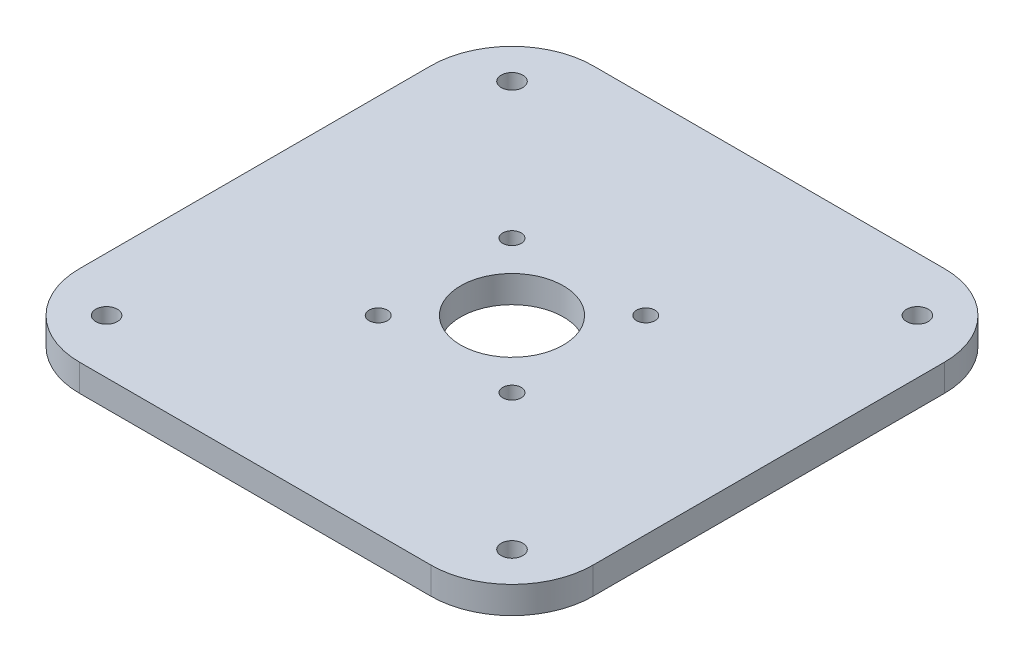
ISO-10303-21;
HEADER;
FILE_DESCRIPTION(('STEP AP214'),'2;1');
FILE_NAME('part.step','',(''),(''),'','','');
FILE_SCHEMA(('AUTOMOTIVE_DESIGN { 1 0 10303 214 1 1 1 1 }'));
ENDSEC;
DATA;
#1=APPLICATION_CONTEXT('core data for automotive mechanical design processes');
#2=APPLICATION_PROTOCOL_DEFINITION('international standard','automotive_design',2000,#1);
#3=PRODUCT_CONTEXT('',#1,'mechanical');
#4=PRODUCT('Part','Part','',(#3));
#5=PRODUCT_RELATED_PRODUCT_CATEGORY('part','',(#4));
#6=PRODUCT_DEFINITION_FORMATION('','',#4);
#7=PRODUCT_DEFINITION_CONTEXT('part definition',#1,'design');
#8=PRODUCT_DEFINITION('design','',#6,#7);
#9=PRODUCT_DEFINITION_SHAPE('','',#8);
#10=(LENGTH_UNIT() NAMED_UNIT(*) SI_UNIT(.MILLI.,.METRE.));
#11=(NAMED_UNIT(*) PLANE_ANGLE_UNIT() SI_UNIT($,.RADIAN.));
#12=(NAMED_UNIT(*) SI_UNIT($,.STERADIAN.) SOLID_ANGLE_UNIT());
#13=UNCERTAINTY_MEASURE_WITH_UNIT(LENGTH_MEASURE(1.E-05),#10,'distance_accuracy_value','');
#14=(GEOMETRIC_REPRESENTATION_CONTEXT(3) GLOBAL_UNCERTAINTY_ASSIGNED_CONTEXT((#13)) GLOBAL_UNIT_ASSIGNED_CONTEXT((#10,
#11,#12)) REPRESENTATION_CONTEXT('',''));
#15=CARTESIAN_POINT('',(0.,0.,0.));
#16=DIRECTION('',(0.,0.,1.));
#17=DIRECTION('',(1.,0.,0.));
#18=AXIS2_PLACEMENT_3D('',#15,#16,#17);
#19=CARTESIAN_POINT('',(-95.,10.,95.));
#20=DIRECTION('',(1.,0.,0.));
#21=DIRECTION('',(0.,0.,-1.));
#22=AXIS2_PLACEMENT_3D('',#19,#20,#21);
#23=PLANE('',#22);
#24=DIRECTION('',(0.,0.,1.));
#25=VECTOR('',#24,1.);
#26=CARTESIAN_POINT('',(-95.,0.,95.));
#27=LINE('',#26,#25);
#28=CARTESIAN_POINT('',(-95.,0.,-65.));
#29=VERTEX_POINT('',#28);
#30=CARTESIAN_POINT('',(-95.,0.,65.));
#31=VERTEX_POINT('',#30);
#32=EDGE_CURVE('E134',#29,#31,#27,.T.);
#33=ORIENTED_EDGE('',*,*,#32,.T.);
#34=DIRECTION('',(0.,-1.,0.));
#35=VECTOR('',#34,1.);
#36=CARTESIAN_POINT('',(-95.,10.,65.));
#37=LINE('',#36,#35);
#38=CARTESIAN_POINT('',(-95.,10.,65.));
#39=VERTEX_POINT('',#38);
#40=EDGE_CURVE('E112',#31,#39,#37,.F.);
#41=ORIENTED_EDGE('',*,*,#40,.T.);
#42=DIRECTION('',(0.,0.,1.));
#43=VECTOR('',#42,1.);
#44=CARTESIAN_POINT('',(-95.,10.,95.));
#45=LINE('',#44,#43);
#46=CARTESIAN_POINT('',(-95.,10.,-65.));
#47=VERTEX_POINT('',#46);
#48=EDGE_CURVE('E144',#47,#39,#45,.T.);
#49=ORIENTED_EDGE('',*,*,#48,.F.);
#50=DIRECTION('',(0.,-1.,0.));
#51=VECTOR('',#50,1.);
#52=CARTESIAN_POINT('',(-95.,10.,-65.));
#53=LINE('',#52,#51);
#54=EDGE_CURVE('E117',#47,#29,#53,.T.);
#55=ORIENTED_EDGE('',*,*,#54,.T.);
#56=EDGE_LOOP('',(#33,#41,#49,#55));
#57=FACE_BOUND('',#56,.T.);
#58=ADVANCED_FACE('F39',(#57),#23,.F.);
#59=CARTESIAN_POINT('',(95.,10.,94.9999999999999));
#60=DIRECTION('',(0.,0.,-1.));
#61=DIRECTION('',(-1.,0.,0.));
#62=AXIS2_PLACEMENT_3D('',#59,#60,#61);
#63=PLANE('',#62);
#64=DIRECTION('',(1.,0.,0.));
#65=VECTOR('',#64,1.);
#66=CARTESIAN_POINT('',(95.,10.,94.9999999999999));
#67=LINE('',#66,#65);
#68=CARTESIAN_POINT('',(-65.,10.,95.));
#69=VERTEX_POINT('',#68);
#70=CARTESIAN_POINT('',(65.,10.,94.9999999999999));
#71=VERTEX_POINT('',#70);
#72=EDGE_CURVE('E127',#69,#71,#67,.T.);
#73=ORIENTED_EDGE('',*,*,#72,.F.);
#74=DIRECTION('',(0.,-1.,0.));
#75=VECTOR('',#74,1.);
#76=CARTESIAN_POINT('',(-65.,10.,95.));
#77=LINE('',#76,#75);
#78=CARTESIAN_POINT('',(-65.,0.,95.));
#79=VERTEX_POINT('',#78);
#80=EDGE_CURVE('E111',#69,#79,#77,.T.);
#81=ORIENTED_EDGE('',*,*,#80,.T.);
#82=DIRECTION('',(1.,0.,0.));
#83=VECTOR('',#82,1.);
#84=CARTESIAN_POINT('',(95.,0.,94.9999999999999));
#85=LINE('',#84,#83);
#86=CARTESIAN_POINT('',(65.,0.,94.9999999999999));
#87=VERTEX_POINT('',#86);
#88=EDGE_CURVE('E124',#79,#87,#85,.T.);
#89=ORIENTED_EDGE('',*,*,#88,.T.);
#90=DIRECTION('',(0.,-1.,0.));
#91=VECTOR('',#90,1.);
#92=CARTESIAN_POINT('',(65.,10.,94.9999999999999));
#93=LINE('',#92,#91);
#94=EDGE_CURVE('E129',#87,#71,#93,.F.);
#95=ORIENTED_EDGE('',*,*,#94,.T.);
#96=EDGE_LOOP('',(#73,#81,#89,#95));
#97=FACE_BOUND('',#96,.T.);
#98=ADVANCED_FACE('F123',(#97),#63,.F.);
#99=CARTESIAN_POINT('',(95.,10.,94.9999999999999));
#100=DIRECTION('',(-1.,0.,0.));
#101=DIRECTION('',(0.,0.,1.));
#102=AXIS2_PLACEMENT_3D('',#99,#100,#101);
#103=PLANE('',#102);
#104=DIRECTION('',(0.,0.,-1.));
#105=VECTOR('',#104,1.);
#106=CARTESIAN_POINT('',(95.,10.,94.9999999999999));
#107=LINE('',#106,#105);
#108=CARTESIAN_POINT('',(95.,10.,64.9999999999999));
#109=VERTEX_POINT('',#108);
#110=CARTESIAN_POINT('',(95.,10.,-65.0000000000001));
#111=VERTEX_POINT('',#110);
#112=EDGE_CURVE('E223',#109,#111,#107,.T.);
#113=ORIENTED_EDGE('',*,*,#112,.F.);
#114=DIRECTION('',(0.,-1.,0.));
#115=VECTOR('',#114,1.);
#116=CARTESIAN_POINT('',(95.,10.,64.9999999999999));
#117=LINE('',#116,#115);
#118=CARTESIAN_POINT('',(95.,0.,64.9999999999999));
#119=VERTEX_POINT('',#118);
#120=EDGE_CURVE('E163',#109,#119,#117,.T.);
#121=ORIENTED_EDGE('',*,*,#120,.T.);
#122=DIRECTION('',(0.,0.,-1.));
#123=VECTOR('',#122,1.);
#124=CARTESIAN_POINT('',(95.,0.,94.9999999999999));
#125=LINE('',#124,#123);
#126=CARTESIAN_POINT('',(95.,0.,-65.0000000000001));
#127=VERTEX_POINT('',#126);
#128=EDGE_CURVE('E133',#119,#127,#125,.T.);
#129=ORIENTED_EDGE('',*,*,#128,.T.);
#130=DIRECTION('',(0.,-1.,0.));
#131=VECTOR('',#130,1.);
#132=CARTESIAN_POINT('',(95.,10.,-65.0000000000001));
#133=LINE('',#132,#131);
#134=EDGE_CURVE('E161',#127,#111,#133,.F.);
#135=ORIENTED_EDGE('',*,*,#134,.T.);
#136=EDGE_LOOP('',(#113,#121,#129,#135));
#137=FACE_BOUND('',#136,.T.);
#138=ADVANCED_FACE('F238',(#137),#103,.F.);
#139=CARTESIAN_POINT('',(95.,10.,-95.0000000000001));
#140=DIRECTION('',(0.,0.,1.));
#141=DIRECTION('',(1.,0.,0.));
#142=AXIS2_PLACEMENT_3D('',#139,#140,#141);
#143=PLANE('',#142);
#144=DIRECTION('',(-1.,0.,0.));
#145=VECTOR('',#144,1.);
#146=CARTESIAN_POINT('',(95.,10.,-95.0000000000001));
#147=LINE('',#146,#145);
#148=CARTESIAN_POINT('',(65.,10.,-95.0000000000001));
#149=VERTEX_POINT('',#148);
#150=CARTESIAN_POINT('',(-65.,10.,-95.));
#151=VERTEX_POINT('',#150);
#152=EDGE_CURVE('E145',#149,#151,#147,.T.);
#153=ORIENTED_EDGE('',*,*,#152,.F.);
#154=DIRECTION('',(0.,-1.,0.));
#155=VECTOR('',#154,1.);
#156=CARTESIAN_POINT('',(65.,10.,-95.0000000000001));
#157=LINE('',#156,#155);
#158=CARTESIAN_POINT('',(65.,0.,-95.0000000000001));
#159=VERTEX_POINT('',#158);
#160=EDGE_CURVE('E11',#149,#159,#157,.T.);
#161=ORIENTED_EDGE('',*,*,#160,.T.);
#162=DIRECTION('',(-1.,0.,0.));
#163=VECTOR('',#162,1.);
#164=CARTESIAN_POINT('',(95.,0.,-95.0000000000001));
#165=LINE('',#164,#163);
#166=CARTESIAN_POINT('',(-65.,0.,-95.));
#167=VERTEX_POINT('',#166);
#168=EDGE_CURVE('E137',#159,#167,#165,.T.);
#169=ORIENTED_EDGE('',*,*,#168,.T.);
#170=DIRECTION('',(0.,-1.,0.));
#171=VECTOR('',#170,1.);
#172=CARTESIAN_POINT('',(-65.,10.,-95.));
#173=LINE('',#172,#171);
#174=EDGE_CURVE('E48',#167,#151,#173,.F.);
#175=ORIENTED_EDGE('',*,*,#174,.T.);
#176=EDGE_LOOP('',(#153,#161,#169,#175));
#177=FACE_BOUND('',#176,.T.);
#178=ADVANCED_FACE('F232',(#177),#143,.F.);
#179=CARTESIAN_POINT('',(0.,10.,0.));
#180=DIRECTION('',(0.,1.,0.));
#181=DIRECTION('',(0.,0.,1.));
#182=AXIS2_PLACEMENT_3D('',#179,#180,#181);
#183=PLANE('',#182);
#184=CARTESIAN_POINT('',(-24.7487373415292,10.,-24.7487373415292));
#185=DIRECTION('',(0.,1.,0.));
#186=DIRECTION('',(0.,0.,1.));
#187=AXIS2_PLACEMENT_3D('',#184,#185,#186);
#188=CIRCLE('',#187,3.39999999999999);
#189=CARTESIAN_POINT('',(-24.7487373415292,10.,-21.3487373415292));
#190=VERTEX_POINT('',#189);
#191=EDGE_CURVE('E183',#190,#190,#188,.T.);
#192=ORIENTED_EDGE('',*,*,#191,.F.);
#193=EDGE_LOOP('',(#192));
#194=FACE_BOUND('',#193,.T.);
#195=CARTESIAN_POINT('',(24.7487373415292,10.,-24.7487373415292));
#196=DIRECTION('',(0.,1.,0.));
#197=DIRECTION('',(0.,0.,1.));
#198=AXIS2_PLACEMENT_3D('',#195,#196,#197);
#199=CIRCLE('',#198,3.39999999999999);
#200=CARTESIAN_POINT('',(24.7487373415292,10.,-21.3487373415292));
#201=VERTEX_POINT('',#200);
#202=EDGE_CURVE('E173',#201,#201,#199,.T.);
#203=ORIENTED_EDGE('',*,*,#202,.F.);
#204=EDGE_LOOP('',(#203));
#205=FACE_BOUND('',#204,.T.);
#206=CARTESIAN_POINT('',(-24.7487373415292,10.,24.7487373415292));
#207=DIRECTION('',(0.,1.,0.));
#208=DIRECTION('',(0.,0.,1.));
#209=AXIS2_PLACEMENT_3D('',#206,#207,#208);
#210=CIRCLE('',#209,3.39999999999999);
#211=CARTESIAN_POINT('',(-24.7487373415292,10.,28.1487373415291));
#212=VERTEX_POINT('',#211);
#213=EDGE_CURVE('E170',#212,#212,#210,.T.);
#214=ORIENTED_EDGE('',*,*,#213,.F.);
#215=EDGE_LOOP('',(#214));
#216=FACE_BOUND('',#215,.T.);
#217=CARTESIAN_POINT('',(24.7487373415292,10.,24.7487373415292));
#218=DIRECTION('',(0.,1.,0.));
#219=DIRECTION('',(0.,0.,1.));
#220=AXIS2_PLACEMENT_3D('',#217,#218,#219);
#221=CIRCLE('',#220,3.39999999999999);
#222=CARTESIAN_POINT('',(24.7487373415292,10.,28.1487373415291));
#223=VERTEX_POINT('',#222);
#224=EDGE_CURVE('E169',#223,#223,#221,.T.);
#225=ORIENTED_EDGE('',*,*,#224,.F.);
#226=EDGE_LOOP('',(#225));
#227=FACE_BOUND('',#226,.T.);
#228=CARTESIAN_POINT('',(-75.,10.,75.));
#229=DIRECTION('',(0.,1.,0.));
#230=DIRECTION('',(0.,0.,-1.));
#231=AXIS2_PLACEMENT_3D('',#228,#229,#230);
#232=CIRCLE('',#231,4.00000000000001);
#233=CARTESIAN_POINT('',(-75.,10.,71.));
#234=VERTEX_POINT('',#233);
#235=EDGE_CURVE('E191',#234,#234,#232,.T.);
#236=ORIENTED_EDGE('',*,*,#235,.F.);
#237=EDGE_LOOP('',(#236));
#238=FACE_BOUND('',#237,.T.);
#239=CARTESIAN_POINT('',(75.,10.,75.));
#240=DIRECTION('',(0.,1.,0.));
#241=DIRECTION('',(0.,0.,1.));
#242=AXIS2_PLACEMENT_3D('',#239,#240,#241);
#243=CIRCLE('',#242,4.00000000000001);
#244=CARTESIAN_POINT('',(75.,10.,79.));
#245=VERTEX_POINT('',#244);
#246=EDGE_CURVE('E208',#245,#245,#243,.T.);
#247=ORIENTED_EDGE('',*,*,#246,.F.);
#248=EDGE_LOOP('',(#247));
#249=FACE_BOUND('',#248,.T.);
#250=CARTESIAN_POINT('',(75.,10.,-75.));
#251=DIRECTION('',(0.,1.,0.));
#252=DIRECTION('',(0.,0.,-1.));
#253=AXIS2_PLACEMENT_3D('',#250,#251,#252);
#254=CIRCLE('',#253,4.00000000000001);
#255=CARTESIAN_POINT('',(75.,10.,-79.));
#256=VERTEX_POINT('',#255);
#257=EDGE_CURVE('E202',#256,#256,#254,.T.);
#258=ORIENTED_EDGE('',*,*,#257,.F.);
#259=EDGE_LOOP('',(#258));
#260=FACE_BOUND('',#259,.T.);
#261=CARTESIAN_POINT('',(-75.,10.,-75.));
#262=DIRECTION('',(0.,1.,0.));
#263=DIRECTION('',(0.,0.,1.));
#264=AXIS2_PLACEMENT_3D('',#261,#262,#263);
#265=CIRCLE('',#264,4.00000000000001);
#266=CARTESIAN_POINT('',(-75.,10.,-71.));
#267=VERTEX_POINT('',#266);
#268=EDGE_CURVE('E196',#267,#267,#265,.T.);
#269=ORIENTED_EDGE('',*,*,#268,.F.);
#270=EDGE_LOOP('',(#269));
#271=FACE_BOUND('',#270,.T.);
#272=CARTESIAN_POINT('',(0.,10.,0.));
#273=DIRECTION('',(0.,1.,0.));
#274=DIRECTION('',(0.,0.,1.));
#275=AXIS2_PLACEMENT_3D('',#272,#273,#274);
#276=CIRCLE('',#275,19.);
#277=CARTESIAN_POINT('',(0.,10.,19.));
#278=VERTEX_POINT('',#277);
#279=EDGE_CURVE('E195',#278,#278,#276,.T.);
#280=ORIENTED_EDGE('',*,*,#279,.F.);
#281=EDGE_LOOP('',(#280));
#282=FACE_BOUND('',#281,.T.);
#283=ORIENTED_EDGE('',*,*,#48,.T.);
#284=CARTESIAN_POINT('',(-65.,10.,65.));
#285=DIRECTION('',(0.,1.,0.));
#286=DIRECTION('',(0.,0.,1.));
#287=AXIS2_PLACEMENT_3D('',#284,#285,#286);
#288=CIRCLE('',#287,30.);
#289=EDGE_CURVE('E159',#39,#69,#288,.T.);
#290=ORIENTED_EDGE('',*,*,#289,.T.);
#291=ORIENTED_EDGE('',*,*,#72,.T.);
#292=CARTESIAN_POINT('',(65.,10.,64.9999999999999));
#293=DIRECTION('',(0.,1.,0.));
#294=DIRECTION('',(0.,0.,1.));
#295=AXIS2_PLACEMENT_3D('',#292,#293,#294);
#296=CIRCLE('',#295,30.);
#297=EDGE_CURVE('E157',#71,#109,#296,.T.);
#298=ORIENTED_EDGE('',*,*,#297,.T.);
#299=ORIENTED_EDGE('',*,*,#112,.T.);
#300=CARTESIAN_POINT('',(65.,10.,-65.0000000000001));
#301=DIRECTION('',(0.,1.,0.));
#302=DIRECTION('',(0.,0.,1.));
#303=AXIS2_PLACEMENT_3D('',#300,#301,#302);
#304=CIRCLE('',#303,30.);
#305=EDGE_CURVE('E62',#111,#149,#304,.T.);
#306=ORIENTED_EDGE('',*,*,#305,.T.);
#307=ORIENTED_EDGE('',*,*,#152,.T.);
#308=CARTESIAN_POINT('',(-65.,10.,-65.));
#309=DIRECTION('',(0.,1.,0.));
#310=DIRECTION('',(0.,0.,1.));
#311=AXIS2_PLACEMENT_3D('',#308,#309,#310);
#312=CIRCLE('',#311,30.);
#313=EDGE_CURVE('E154',#151,#47,#312,.T.);
#314=ORIENTED_EDGE('',*,*,#313,.T.);
#315=EDGE_LOOP('',(#283,#290,#291,#298,#299,#306,#307,#314));
#316=FACE_BOUND('',#315,.T.);
#317=ADVANCED_FACE('F225',(#194,#205,#216,#227,#238,#249,#260,#271,#282,#316),#183,.T.);
#318=CARTESIAN_POINT('',(0.,0.,0.));
#319=DIRECTION('',(0.,1.,0.));
#320=DIRECTION('',(0.,0.,1.));
#321=AXIS2_PLACEMENT_3D('',#318,#319,#320);
#322=PLANE('',#321);
#323=CARTESIAN_POINT('',(-24.7487373415292,0.,-24.7487373415292));
#324=DIRECTION('',(0.,1.,0.));
#325=DIRECTION('',(0.,0.,1.));
#326=AXIS2_PLACEMENT_3D('',#323,#324,#325);
#327=CIRCLE('',#326,3.39999999999999);
#328=CARTESIAN_POINT('',(-24.7487373415292,0.,-21.3487373415292));
#329=VERTEX_POINT('',#328);
#330=EDGE_CURVE('E43',#329,#329,#327,.T.);
#331=ORIENTED_EDGE('',*,*,#330,.T.);
#332=EDGE_LOOP('',(#331));
#333=FACE_BOUND('',#332,.T.);
#334=CARTESIAN_POINT('',(24.7487373415292,0.,-24.7487373415292));
#335=DIRECTION('',(0.,1.,0.));
#336=DIRECTION('',(0.,0.,1.));
#337=AXIS2_PLACEMENT_3D('',#334,#335,#336);
#338=CIRCLE('',#337,3.39999999999999);
#339=CARTESIAN_POINT('',(24.7487373415292,0.,-21.3487373415292));
#340=VERTEX_POINT('',#339);
#341=EDGE_CURVE('E171',#340,#340,#338,.T.);
#342=ORIENTED_EDGE('',*,*,#341,.T.);
#343=EDGE_LOOP('',(#342));
#344=FACE_BOUND('',#343,.T.);
#345=CARTESIAN_POINT('',(-24.7487373415292,0.,24.7487373415292));
#346=DIRECTION('',(0.,1.,0.));
#347=DIRECTION('',(0.,0.,1.));
#348=AXIS2_PLACEMENT_3D('',#345,#346,#347);
#349=CIRCLE('',#348,3.39999999999999);
#350=CARTESIAN_POINT('',(-24.7487373415292,0.,28.1487373415291));
#351=VERTEX_POINT('',#350);
#352=EDGE_CURVE('E167',#351,#351,#349,.T.);
#353=ORIENTED_EDGE('',*,*,#352,.T.);
#354=EDGE_LOOP('',(#353));
#355=FACE_BOUND('',#354,.T.);
#356=CARTESIAN_POINT('',(24.7487373415292,0.,24.7487373415292));
#357=DIRECTION('',(0.,1.,0.));
#358=DIRECTION('',(0.,0.,1.));
#359=AXIS2_PLACEMENT_3D('',#356,#357,#358);
#360=CIRCLE('',#359,3.39999999999999);
#361=CARTESIAN_POINT('',(24.7487373415292,0.,28.1487373415291));
#362=VERTEX_POINT('',#361);
#363=EDGE_CURVE('E188',#362,#362,#360,.T.);
#364=ORIENTED_EDGE('',*,*,#363,.T.);
#365=EDGE_LOOP('',(#364));
#366=FACE_BOUND('',#365,.T.);
#367=CARTESIAN_POINT('',(-75.,0.,75.));
#368=DIRECTION('',(0.,1.,0.));
#369=DIRECTION('',(0.,0.,-1.));
#370=AXIS2_PLACEMENT_3D('',#367,#368,#369);
#371=CIRCLE('',#370,4.00000000000001);
#372=CARTESIAN_POINT('',(-75.,0.,71.));
#373=VERTEX_POINT('',#372);
#374=EDGE_CURVE('E211',#373,#373,#371,.T.);
#375=ORIENTED_EDGE('',*,*,#374,.T.);
#376=EDGE_LOOP('',(#375));
#377=FACE_BOUND('',#376,.T.);
#378=CARTESIAN_POINT('',(75.,0.,75.));
#379=DIRECTION('',(0.,1.,0.));
#380=DIRECTION('',(0.,0.,1.));
#381=AXIS2_PLACEMENT_3D('',#378,#379,#380);
#382=CIRCLE('',#381,4.00000000000001);
#383=CARTESIAN_POINT('',(75.,0.,79.));
#384=VERTEX_POINT('',#383);
#385=EDGE_CURVE('E205',#384,#384,#382,.T.);
#386=ORIENTED_EDGE('',*,*,#385,.T.);
#387=EDGE_LOOP('',(#386));
#388=FACE_BOUND('',#387,.T.);
#389=CARTESIAN_POINT('',(75.,0.,-75.));
#390=DIRECTION('',(0.,1.,0.));
#391=DIRECTION('',(0.,0.,-1.));
#392=AXIS2_PLACEMENT_3D('',#389,#390,#391);
#393=CIRCLE('',#392,4.00000000000001);
#394=CARTESIAN_POINT('',(75.,0.,-79.));
#395=VERTEX_POINT('',#394);
#396=EDGE_CURVE('E199',#395,#395,#393,.T.);
#397=ORIENTED_EDGE('',*,*,#396,.T.);
#398=EDGE_LOOP('',(#397));
#399=FACE_BOUND('',#398,.T.);
#400=CARTESIAN_POINT('',(-75.,0.,-75.));
#401=DIRECTION('',(0.,1.,0.));
#402=DIRECTION('',(0.,0.,1.));
#403=AXIS2_PLACEMENT_3D('',#400,#401,#402);
#404=CIRCLE('',#403,4.00000000000001);
#405=CARTESIAN_POINT('',(-75.,0.,-71.));
#406=VERTEX_POINT('',#405);
#407=EDGE_CURVE('E192',#406,#406,#404,.T.);
#408=ORIENTED_EDGE('',*,*,#407,.T.);
#409=EDGE_LOOP('',(#408));
#410=FACE_BOUND('',#409,.T.);
#411=CARTESIAN_POINT('',(0.,0.,0.));
#412=DIRECTION('',(0.,1.,0.));
#413=DIRECTION('',(0.,0.,1.));
#414=AXIS2_PLACEMENT_3D('',#411,#412,#413);
#415=CIRCLE('',#414,19.);
#416=CARTESIAN_POINT('',(0.,0.,19.));
#417=VERTEX_POINT('',#416);
#418=EDGE_CURVE('E139',#417,#417,#415,.T.);
#419=ORIENTED_EDGE('',*,*,#418,.T.);
#420=EDGE_LOOP('',(#419));
#421=FACE_BOUND('',#420,.T.);
#422=ORIENTED_EDGE('',*,*,#88,.F.);
#423=CARTESIAN_POINT('',(-65.,0.,65.));
#424=DIRECTION('',(0.,1.,0.));
#425=DIRECTION('',(0.,0.,1.));
#426=AXIS2_PLACEMENT_3D('',#423,#424,#425);
#427=CIRCLE('',#426,30.);
#428=EDGE_CURVE('E107',#79,#31,#427,.F.);
#429=ORIENTED_EDGE('',*,*,#428,.T.);
#430=ORIENTED_EDGE('',*,*,#32,.F.);
#431=CARTESIAN_POINT('',(-65.,0.,-65.));
#432=DIRECTION('',(0.,1.,0.));
#433=DIRECTION('',(0.,0.,1.));
#434=AXIS2_PLACEMENT_3D('',#431,#432,#433);
#435=CIRCLE('',#434,30.);
#436=EDGE_CURVE('E128',#29,#167,#435,.F.);
#437=ORIENTED_EDGE('',*,*,#436,.T.);
#438=ORIENTED_EDGE('',*,*,#168,.F.);
#439=CARTESIAN_POINT('',(65.,0.,-65.0000000000001));
#440=DIRECTION('',(0.,1.,0.));
#441=DIRECTION('',(0.,0.,1.));
#442=AXIS2_PLACEMENT_3D('',#439,#440,#441);
#443=CIRCLE('',#442,30.);
#444=EDGE_CURVE('E148',#159,#127,#443,.F.);
#445=ORIENTED_EDGE('',*,*,#444,.T.);
#446=ORIENTED_EDGE('',*,*,#128,.F.);
#447=CARTESIAN_POINT('',(65.,0.,64.9999999999999));
#448=DIRECTION('',(0.,1.,0.));
#449=DIRECTION('',(0.,0.,1.));
#450=AXIS2_PLACEMENT_3D('',#447,#448,#449);
#451=CIRCLE('',#450,30.);
#452=EDGE_CURVE('E118',#119,#87,#451,.F.);
#453=ORIENTED_EDGE('',*,*,#452,.T.);
#454=EDGE_LOOP('',(#422,#429,#430,#437,#438,#445,#446,#453));
#455=FACE_BOUND('',#454,.T.);
#456=ADVANCED_FACE('F131',(#333,#344,#355,#366,#377,#388,#399,#410,#421,#455),#322,.F.);
#457=CARTESIAN_POINT('',(0.,0.,0.));
#458=DIRECTION('',(0.,1.,0.));
#459=DIRECTION('',(0.,0.,1.));
#460=AXIS2_PLACEMENT_3D('',#457,#458,#459);
#461=CYLINDRICAL_SURFACE('',#460,19.);
#462=ORIENTED_EDGE('',*,*,#418,.F.);
#463=EDGE_LOOP('',(#462));
#464=FACE_BOUND('',#463,.T.);
#465=ORIENTED_EDGE('',*,*,#279,.T.);
#466=EDGE_LOOP('',(#465));
#467=FACE_BOUND('',#466,.T.);
#468=ADVANCED_FACE('F264',(#464,#467),#461,.F.);
#469=CARTESIAN_POINT('',(-75.,0.,-75.));
#470=DIRECTION('',(0.,1.,0.));
#471=DIRECTION('',(0.,0.,1.));
#472=AXIS2_PLACEMENT_3D('',#469,#470,#471);
#473=CYLINDRICAL_SURFACE('',#472,4.00000000000001);
#474=ORIENTED_EDGE('',*,*,#407,.F.);
#475=EDGE_LOOP('',(#474));
#476=FACE_BOUND('',#475,.T.);
#477=ORIENTED_EDGE('',*,*,#268,.T.);
#478=EDGE_LOOP('',(#477));
#479=FACE_BOUND('',#478,.T.);
#480=ADVANCED_FACE('F271',(#476,#479),#473,.F.);
#481=CARTESIAN_POINT('',(75.,0.,-75.));
#482=DIRECTION('',(0.,1.,0.));
#483=DIRECTION('',(0.,0.,1.));
#484=AXIS2_PLACEMENT_3D('',#481,#482,#483);
#485=CYLINDRICAL_SURFACE('',#484,4.00000000000001);
#486=ORIENTED_EDGE('',*,*,#396,.F.);
#487=EDGE_LOOP('',(#486));
#488=FACE_BOUND('',#487,.T.);
#489=ORIENTED_EDGE('',*,*,#257,.T.);
#490=EDGE_LOOP('',(#489));
#491=FACE_BOUND('',#490,.T.);
#492=ADVANCED_FACE('F279',(#488,#491),#485,.F.);
#493=CARTESIAN_POINT('',(75.,0.,75.));
#494=DIRECTION('',(0.,1.,0.));
#495=DIRECTION('',(0.,0.,1.));
#496=AXIS2_PLACEMENT_3D('',#493,#494,#495);
#497=CYLINDRICAL_SURFACE('',#496,4.00000000000001);
#498=ORIENTED_EDGE('',*,*,#385,.F.);
#499=EDGE_LOOP('',(#498));
#500=FACE_BOUND('',#499,.T.);
#501=ORIENTED_EDGE('',*,*,#246,.T.);
#502=EDGE_LOOP('',(#501));
#503=FACE_BOUND('',#502,.T.);
#504=ADVANCED_FACE('F275',(#500,#503),#497,.F.);
#505=CARTESIAN_POINT('',(-75.,0.,75.));
#506=DIRECTION('',(0.,1.,0.));
#507=DIRECTION('',(0.,0.,1.));
#508=AXIS2_PLACEMENT_3D('',#505,#506,#507);
#509=CYLINDRICAL_SURFACE('',#508,4.00000000000001);
#510=ORIENTED_EDGE('',*,*,#374,.F.);
#511=EDGE_LOOP('',(#510));
#512=FACE_BOUND('',#511,.T.);
#513=ORIENTED_EDGE('',*,*,#235,.T.);
#514=EDGE_LOOP('',(#513));
#515=FACE_BOUND('',#514,.T.);
#516=ADVANCED_FACE('F249',(#512,#515),#509,.F.);
#517=CARTESIAN_POINT('',(-65.,10.,65.));
#518=DIRECTION('',(0.,-1.,0.));
#519=DIRECTION('',(0.,0.,-1.));
#520=AXIS2_PLACEMENT_3D('',#517,#518,#519);
#521=CYLINDRICAL_SURFACE('',#520,30.);
#522=ORIENTED_EDGE('',*,*,#289,.F.);
#523=ORIENTED_EDGE('',*,*,#40,.F.);
#524=ORIENTED_EDGE('',*,*,#428,.F.);
#525=ORIENTED_EDGE('',*,*,#80,.F.);
#526=EDGE_LOOP('',(#522,#523,#524,#525));
#527=FACE_BOUND('',#526,.T.);
#528=ADVANCED_FACE('F110',(#527),#521,.T.);
#529=CARTESIAN_POINT('',(65.,10.,64.9999999999999));
#530=DIRECTION('',(0.,-1.,0.));
#531=DIRECTION('',(0.,0.,-1.));
#532=AXIS2_PLACEMENT_3D('',#529,#530,#531);
#533=CYLINDRICAL_SURFACE('',#532,30.);
#534=ORIENTED_EDGE('',*,*,#297,.F.);
#535=ORIENTED_EDGE('',*,*,#94,.F.);
#536=ORIENTED_EDGE('',*,*,#452,.F.);
#537=ORIENTED_EDGE('',*,*,#120,.F.);
#538=EDGE_LOOP('',(#534,#535,#536,#537));
#539=FACE_BOUND('',#538,.T.);
#540=ADVANCED_FACE('F242',(#539),#533,.T.);
#541=CARTESIAN_POINT('',(65.,10.,-65.0000000000001));
#542=DIRECTION('',(0.,-1.,0.));
#543=DIRECTION('',(0.,0.,-1.));
#544=AXIS2_PLACEMENT_3D('',#541,#542,#543);
#545=CYLINDRICAL_SURFACE('',#544,30.);
#546=ORIENTED_EDGE('',*,*,#305,.F.);
#547=ORIENTED_EDGE('',*,*,#134,.F.);
#548=ORIENTED_EDGE('',*,*,#444,.F.);
#549=ORIENTED_EDGE('',*,*,#160,.F.);
#550=EDGE_LOOP('',(#546,#547,#548,#549));
#551=FACE_BOUND('',#550,.T.);
#552=ADVANCED_FACE('F234',(#551),#545,.T.);
#553=CARTESIAN_POINT('',(-65.,10.,-65.));
#554=DIRECTION('',(0.,-1.,0.));
#555=DIRECTION('',(0.,0.,-1.));
#556=AXIS2_PLACEMENT_3D('',#553,#554,#555);
#557=CYLINDRICAL_SURFACE('',#556,30.);
#558=ORIENTED_EDGE('',*,*,#313,.F.);
#559=ORIENTED_EDGE('',*,*,#174,.F.);
#560=ORIENTED_EDGE('',*,*,#436,.F.);
#561=ORIENTED_EDGE('',*,*,#54,.F.);
#562=EDGE_LOOP('',(#558,#559,#560,#561));
#563=FACE_BOUND('',#562,.T.);
#564=ADVANCED_FACE('F41',(#563),#557,.T.);
#565=CARTESIAN_POINT('',(24.7487373415292,10.,24.7487373415292));
#566=DIRECTION('',(0.,1.,0.));
#567=DIRECTION('',(0.,0.,1.));
#568=AXIS2_PLACEMENT_3D('',#565,#566,#567);
#569=CYLINDRICAL_SURFACE('',#568,3.39999999999999);
#570=ORIENTED_EDGE('',*,*,#224,.T.);
#571=EDGE_LOOP('',(#570));
#572=FACE_BOUND('',#571,.T.);
#573=ORIENTED_EDGE('',*,*,#363,.F.);
#574=EDGE_LOOP('',(#573));
#575=FACE_BOUND('',#574,.T.);
#576=ADVANCED_FACE('F287',(#572,#575),#569,.F.);
#577=CARTESIAN_POINT('',(-24.7487373415292,10.,24.7487373415292));
#578=DIRECTION('',(0.,1.,0.));
#579=DIRECTION('',(0.,0.,1.));
#580=AXIS2_PLACEMENT_3D('',#577,#578,#579);
#581=CYLINDRICAL_SURFACE('',#580,3.39999999999999);
#582=ORIENTED_EDGE('',*,*,#213,.T.);
#583=EDGE_LOOP('',(#582));
#584=FACE_BOUND('',#583,.T.);
#585=ORIENTED_EDGE('',*,*,#352,.F.);
#586=EDGE_LOOP('',(#585));
#587=FACE_BOUND('',#586,.T.);
#588=ADVANCED_FACE('F290',(#584,#587),#581,.F.);
#589=CARTESIAN_POINT('',(24.7487373415292,10.,-24.7487373415292));
#590=DIRECTION('',(0.,1.,0.));
#591=DIRECTION('',(0.,0.,1.));
#592=AXIS2_PLACEMENT_3D('',#589,#590,#591);
#593=CYLINDRICAL_SURFACE('',#592,3.39999999999999);
#594=ORIENTED_EDGE('',*,*,#202,.T.);
#595=EDGE_LOOP('',(#594));
#596=FACE_BOUND('',#595,.T.);
#597=ORIENTED_EDGE('',*,*,#341,.F.);
#598=EDGE_LOOP('',(#597));
#599=FACE_BOUND('',#598,.T.);
#600=ADVANCED_FACE('F294',(#596,#599),#593,.F.);
#601=CARTESIAN_POINT('',(-24.7487373415292,10.,-24.7487373415292));
#602=DIRECTION('',(0.,1.,0.));
#603=DIRECTION('',(0.,0.,1.));
#604=AXIS2_PLACEMENT_3D('',#601,#602,#603);
#605=CYLINDRICAL_SURFACE('',#604,3.39999999999999);
#606=ORIENTED_EDGE('',*,*,#191,.T.);
#607=EDGE_LOOP('',(#606));
#608=FACE_BOUND('',#607,.T.);
#609=ORIENTED_EDGE('',*,*,#330,.F.);
#610=EDGE_LOOP('',(#609));
#611=FACE_BOUND('',#610,.T.);
#612=ADVANCED_FACE('F298',(#608,#611),#605,.F.);
#613=CLOSED_SHELL('',(#58,#98,#138,#178,#317,#456,#468,#480,#492,#504,#516,#528,#540,#552,#564,
#576,#588,#600,#612));
#614=MANIFOLD_SOLID_BREP('B2',#613);
#615=ADVANCED_BREP_SHAPE_REPRESENTATION('',(#18,#614),#14);
#616=SHAPE_DEFINITION_REPRESENTATION(#9,#615);
ENDSEC;
END-ISO-10303-21;
